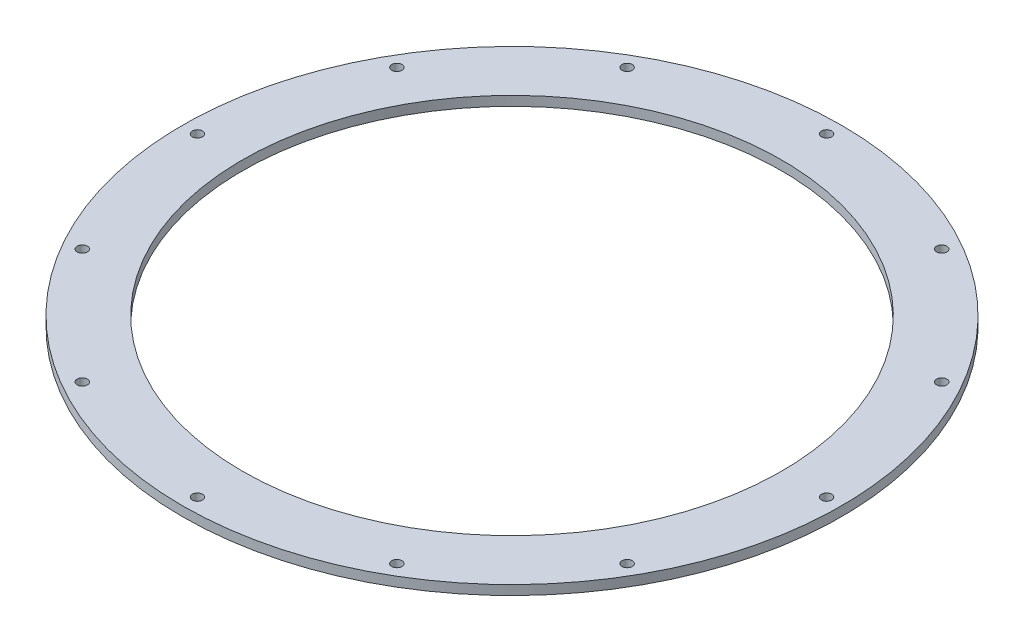
ISO-10303-21;
HEADER;
FILE_DESCRIPTION(('STEP AP214'),'2;1');
FILE_NAME('part.step','',(''),(''),'','','');
FILE_SCHEMA(('AUTOMOTIVE_DESIGN { 1 0 10303 214 1 1 1 1 }'));
ENDSEC;
DATA;
#1=APPLICATION_CONTEXT('core data for automotive mechanical design processes');
#2=APPLICATION_PROTOCOL_DEFINITION('international standard','automotive_design',2000,#1);
#3=PRODUCT_CONTEXT('',#1,'mechanical');
#4=PRODUCT('Part','Part','',(#3));
#5=PRODUCT_RELATED_PRODUCT_CATEGORY('part','',(#4));
#6=PRODUCT_DEFINITION_FORMATION('','',#4);
#7=PRODUCT_DEFINITION_CONTEXT('part definition',#1,'design');
#8=PRODUCT_DEFINITION('design','',#6,#7);
#9=PRODUCT_DEFINITION_SHAPE('','',#8);
#10=(LENGTH_UNIT() NAMED_UNIT(*) SI_UNIT(.MILLI.,.METRE.));
#11=(NAMED_UNIT(*) PLANE_ANGLE_UNIT() SI_UNIT($,.RADIAN.));
#12=(NAMED_UNIT(*) SI_UNIT($,.STERADIAN.) SOLID_ANGLE_UNIT());
#13=UNCERTAINTY_MEASURE_WITH_UNIT(LENGTH_MEASURE(1.E-05),#10,'distance_accuracy_value','');
#14=(GEOMETRIC_REPRESENTATION_CONTEXT(3) GLOBAL_UNCERTAINTY_ASSIGNED_CONTEXT((#13)) GLOBAL_UNIT_ASSIGNED_CONTEXT((#10,
#11,#12)) REPRESENTATION_CONTEXT('',''));
#15=CARTESIAN_POINT('',(0.,0.,0.));
#16=DIRECTION('',(0.,0.,1.));
#17=DIRECTION('',(1.,0.,0.));
#18=AXIS2_PLACEMENT_3D('',#15,#16,#17);
#19=CARTESIAN_POINT('',(0.,3.175,0.));
#20=DIRECTION('',(0.,1.,0.));
#21=DIRECTION('',(0.,0.,1.));
#22=AXIS2_PLACEMENT_3D('',#19,#20,#21);
#23=PLANE('',#22);
#24=CARTESIAN_POINT('',(0.,3.175,-105.));
#25=DIRECTION('',(0.,1.,0.));
#26=DIRECTION('',(0.,0.,1.));
#27=AXIS2_PLACEMENT_3D('',#24,#25,#26);
#28=CIRCLE('',#27,1.69999999999999);
#29=CARTESIAN_POINT('',(0.,3.175,-103.3));
#30=VERTEX_POINT('',#29);
#31=EDGE_CURVE('E120',#30,#30,#28,.T.);
#32=ORIENTED_EDGE('',*,*,#31,.F.);
#33=EDGE_LOOP('',(#32));
#34=FACE_BOUND('',#33,.T.);
#35=CARTESIAN_POINT('',(52.5,3.175,-90.9326673973661));
#36=DIRECTION('',(0.,1.,0.));
#37=DIRECTION('',(0.,0.,1.));
#38=AXIS2_PLACEMENT_3D('',#35,#36,#37);
#39=CIRCLE('',#38,1.69999999999999);
#40=CARTESIAN_POINT('',(52.5,3.175,-89.2326673973661));
#41=VERTEX_POINT('',#40);
#42=EDGE_CURVE('E114',#41,#41,#39,.T.);
#43=ORIENTED_EDGE('',*,*,#42,.F.);
#44=EDGE_LOOP('',(#43));
#45=FACE_BOUND('',#44,.T.);
#46=CARTESIAN_POINT('',(90.932667397366,3.175,-52.5));
#47=DIRECTION('',(0.,1.,0.));
#48=DIRECTION('',(0.,0.,1.));
#49=AXIS2_PLACEMENT_3D('',#46,#47,#48);
#50=CIRCLE('',#49,1.69999999999999);
#51=CARTESIAN_POINT('',(90.932667397366,3.175,-50.8));
#52=VERTEX_POINT('',#51);
#53=EDGE_CURVE('E108',#52,#52,#50,.T.);
#54=ORIENTED_EDGE('',*,*,#53,.F.);
#55=EDGE_LOOP('',(#54));
#56=FACE_BOUND('',#55,.T.);
#57=CARTESIAN_POINT('',(105.,3.175,0.));
#58=DIRECTION('',(0.,1.,0.));
#59=DIRECTION('',(0.,0.,1.));
#60=AXIS2_PLACEMENT_3D('',#57,#58,#59);
#61=CIRCLE('',#60,1.69999999999999);
#62=CARTESIAN_POINT('',(105.,3.175,1.69999999999999));
#63=VERTEX_POINT('',#62);
#64=EDGE_CURVE('E102',#63,#63,#61,.T.);
#65=ORIENTED_EDGE('',*,*,#64,.F.);
#66=EDGE_LOOP('',(#65));
#67=FACE_BOUND('',#66,.T.);
#68=CARTESIAN_POINT('',(90.9326673973661,3.175,52.5));
#69=DIRECTION('',(0.,1.,0.));
#70=DIRECTION('',(0.,0.,1.));
#71=AXIS2_PLACEMENT_3D('',#68,#69,#70);
#72=CIRCLE('',#71,1.69999999999999);
#73=CARTESIAN_POINT('',(90.9326673973661,3.175,54.2));
#74=VERTEX_POINT('',#73);
#75=EDGE_CURVE('E96',#74,#74,#72,.T.);
#76=ORIENTED_EDGE('',*,*,#75,.F.);
#77=EDGE_LOOP('',(#76));
#78=FACE_BOUND('',#77,.T.);
#79=CARTESIAN_POINT('',(52.5,3.175,90.932667397366));
#80=DIRECTION('',(0.,1.,0.));
#81=DIRECTION('',(0.,0.,1.));
#82=AXIS2_PLACEMENT_3D('',#79,#80,#81);
#83=CIRCLE('',#82,1.69999999999999);
#84=CARTESIAN_POINT('',(52.5,3.175,92.632667397366));
#85=VERTEX_POINT('',#84);
#86=EDGE_CURVE('E90',#85,#85,#83,.T.);
#87=ORIENTED_EDGE('',*,*,#86,.F.);
#88=EDGE_LOOP('',(#87));
#89=FACE_BOUND('',#88,.T.);
#90=CARTESIAN_POINT('',(0.,3.175,105.));
#91=DIRECTION('',(0.,1.,0.));
#92=DIRECTION('',(0.,0.,1.));
#93=AXIS2_PLACEMENT_3D('',#90,#91,#92);
#94=CIRCLE('',#93,1.69999999999999);
#95=CARTESIAN_POINT('',(0.,3.175,106.7));
#96=VERTEX_POINT('',#95);
#97=EDGE_CURVE('E84',#96,#96,#94,.T.);
#98=ORIENTED_EDGE('',*,*,#97,.F.);
#99=EDGE_LOOP('',(#98));
#100=FACE_BOUND('',#99,.T.);
#101=CARTESIAN_POINT('',(-52.5,3.175,90.9326673973661));
#102=DIRECTION('',(0.,1.,0.));
#103=DIRECTION('',(0.,0.,1.));
#104=AXIS2_PLACEMENT_3D('',#101,#102,#103);
#105=CIRCLE('',#104,1.69999999999999);
#106=CARTESIAN_POINT('',(-52.5,3.175,92.6326673973661));
#107=VERTEX_POINT('',#106);
#108=EDGE_CURVE('E78',#107,#107,#105,.T.);
#109=ORIENTED_EDGE('',*,*,#108,.F.);
#110=EDGE_LOOP('',(#109));
#111=FACE_BOUND('',#110,.T.);
#112=CARTESIAN_POINT('',(-90.932667397366,3.175,52.5));
#113=DIRECTION('',(0.,1.,0.));
#114=DIRECTION('',(0.,0.,1.));
#115=AXIS2_PLACEMENT_3D('',#112,#113,#114);
#116=CIRCLE('',#115,1.69999999999999);
#117=CARTESIAN_POINT('',(-90.932667397366,3.175,54.2));
#118=VERTEX_POINT('',#117);
#119=EDGE_CURVE('E72',#118,#118,#116,.T.);
#120=ORIENTED_EDGE('',*,*,#119,.F.);
#121=EDGE_LOOP('',(#120));
#122=FACE_BOUND('',#121,.T.);
#123=CARTESIAN_POINT('',(-105.,3.175,0.));
#124=DIRECTION('',(0.,1.,0.));
#125=DIRECTION('',(0.,0.,1.));
#126=AXIS2_PLACEMENT_3D('',#123,#124,#125);
#127=CIRCLE('',#126,1.69999999999999);
#128=CARTESIAN_POINT('',(-105.,3.175,1.70000000000001));
#129=VERTEX_POINT('',#128);
#130=EDGE_CURVE('E66',#129,#129,#127,.T.);
#131=ORIENTED_EDGE('',*,*,#130,.F.);
#132=EDGE_LOOP('',(#131));
#133=FACE_BOUND('',#132,.T.);
#134=CARTESIAN_POINT('',(-90.9326673973661,3.175,-52.4999999999999));
#135=DIRECTION('',(0.,1.,0.));
#136=DIRECTION('',(0.,0.,1.));
#137=AXIS2_PLACEMENT_3D('',#134,#135,#136);
#138=CIRCLE('',#137,1.69999999999999);
#139=CARTESIAN_POINT('',(-90.9326673973661,3.175,-50.7999999999999));
#140=VERTEX_POINT('',#139);
#141=EDGE_CURVE('E60',#140,#140,#138,.T.);
#142=ORIENTED_EDGE('',*,*,#141,.F.);
#143=EDGE_LOOP('',(#142));
#144=FACE_BOUND('',#143,.T.);
#145=CARTESIAN_POINT('',(-52.5,3.175,-90.932667397366));
#146=DIRECTION('',(0.,1.,0.));
#147=DIRECTION('',(0.,0.,1.));
#148=AXIS2_PLACEMENT_3D('',#145,#146,#147);
#149=CIRCLE('',#148,1.69999999999999);
#150=CARTESIAN_POINT('',(-52.5,3.175,-89.2326673973661));
#151=VERTEX_POINT('',#150);
#152=EDGE_CURVE('E54',#151,#151,#149,.T.);
#153=ORIENTED_EDGE('',*,*,#152,.F.);
#154=EDGE_LOOP('',(#153));
#155=FACE_BOUND('',#154,.T.);
#156=CARTESIAN_POINT('',(0.,3.175,0.));
#157=DIRECTION('',(0.,1.,0.));
#158=DIRECTION('',(0.,0.,1.));
#159=AXIS2_PLACEMENT_3D('',#156,#157,#158);
#160=CIRCLE('',#159,110.);
#161=CARTESIAN_POINT('',(0.,3.175,110.));
#162=VERTEX_POINT('',#161);
#163=EDGE_CURVE('E10',#162,#162,#160,.T.);
#164=ORIENTED_EDGE('',*,*,#163,.T.);
#165=EDGE_LOOP('',(#164));
#166=FACE_BOUND('',#165,.T.);
#167=CARTESIAN_POINT('',(0.,3.175,0.));
#168=DIRECTION('',(0.,1.,0.));
#169=DIRECTION('',(0.,0.,1.));
#170=AXIS2_PLACEMENT_3D('',#167,#168,#169);
#171=CIRCLE('',#170,90.);
#172=CARTESIAN_POINT('',(0.,3.175,90.));
#173=VERTEX_POINT('',#172);
#174=EDGE_CURVE('E44',#173,#173,#171,.T.);
#175=ORIENTED_EDGE('',*,*,#174,.F.);
#176=EDGE_LOOP('',(#175));
#177=FACE_BOUND('',#176,.T.);
#178=ADVANCED_FACE('F33',(#34,#45,#56,#67,#78,#89,#100,#111,#122,#133,#144,#155,#166,#177),#23,.T.);
#179=CARTESIAN_POINT('',(0.,0.,0.));
#180=DIRECTION('',(0.,1.,0.));
#181=DIRECTION('',(0.,0.,1.));
#182=AXIS2_PLACEMENT_3D('',#179,#180,#181);
#183=PLANE('',#182);
#184=CARTESIAN_POINT('',(0.,0.,-105.));
#185=DIRECTION('',(0.,1.,0.));
#186=DIRECTION('',(0.,0.,1.));
#187=AXIS2_PLACEMENT_3D('',#184,#185,#186);
#188=CIRCLE('',#187,1.69999999999999);
#189=CARTESIAN_POINT('',(0.,0.,-103.3));
#190=VERTEX_POINT('',#189);
#191=EDGE_CURVE('E117',#190,#190,#188,.T.);
#192=ORIENTED_EDGE('',*,*,#191,.T.);
#193=EDGE_LOOP('',(#192));
#194=FACE_BOUND('',#193,.T.);
#195=CARTESIAN_POINT('',(52.5,0.,-90.9326673973661));
#196=DIRECTION('',(0.,1.,0.));
#197=DIRECTION('',(0.,0.,1.));
#198=AXIS2_PLACEMENT_3D('',#195,#196,#197);
#199=CIRCLE('',#198,1.69999999999999);
#200=CARTESIAN_POINT('',(52.5,0.,-89.2326673973661));
#201=VERTEX_POINT('',#200);
#202=EDGE_CURVE('E111',#201,#201,#199,.T.);
#203=ORIENTED_EDGE('',*,*,#202,.T.);
#204=EDGE_LOOP('',(#203));
#205=FACE_BOUND('',#204,.T.);
#206=CARTESIAN_POINT('',(90.932667397366,0.,-52.5));
#207=DIRECTION('',(0.,1.,0.));
#208=DIRECTION('',(0.,0.,1.));
#209=AXIS2_PLACEMENT_3D('',#206,#207,#208);
#210=CIRCLE('',#209,1.69999999999999);
#211=CARTESIAN_POINT('',(90.932667397366,0.,-50.8));
#212=VERTEX_POINT('',#211);
#213=EDGE_CURVE('E105',#212,#212,#210,.T.);
#214=ORIENTED_EDGE('',*,*,#213,.T.);
#215=EDGE_LOOP('',(#214));
#216=FACE_BOUND('',#215,.T.);
#217=CARTESIAN_POINT('',(105.,0.,0.));
#218=DIRECTION('',(0.,1.,0.));
#219=DIRECTION('',(0.,0.,1.));
#220=AXIS2_PLACEMENT_3D('',#217,#218,#219);
#221=CIRCLE('',#220,1.69999999999999);
#222=CARTESIAN_POINT('',(105.,0.,1.69999999999999));
#223=VERTEX_POINT('',#222);
#224=EDGE_CURVE('E99',#223,#223,#221,.T.);
#225=ORIENTED_EDGE('',*,*,#224,.T.);
#226=EDGE_LOOP('',(#225));
#227=FACE_BOUND('',#226,.T.);
#228=CARTESIAN_POINT('',(90.9326673973661,0.,52.5));
#229=DIRECTION('',(0.,1.,0.));
#230=DIRECTION('',(0.,0.,1.));
#231=AXIS2_PLACEMENT_3D('',#228,#229,#230);
#232=CIRCLE('',#231,1.69999999999999);
#233=CARTESIAN_POINT('',(90.9326673973661,0.,54.2));
#234=VERTEX_POINT('',#233);
#235=EDGE_CURVE('E93',#234,#234,#232,.T.);
#236=ORIENTED_EDGE('',*,*,#235,.T.);
#237=EDGE_LOOP('',(#236));
#238=FACE_BOUND('',#237,.T.);
#239=CARTESIAN_POINT('',(52.5,0.,90.932667397366));
#240=DIRECTION('',(0.,1.,0.));
#241=DIRECTION('',(0.,0.,1.));
#242=AXIS2_PLACEMENT_3D('',#239,#240,#241);
#243=CIRCLE('',#242,1.69999999999999);
#244=CARTESIAN_POINT('',(52.5,0.,92.632667397366));
#245=VERTEX_POINT('',#244);
#246=EDGE_CURVE('E87',#245,#245,#243,.T.);
#247=ORIENTED_EDGE('',*,*,#246,.T.);
#248=EDGE_LOOP('',(#247));
#249=FACE_BOUND('',#248,.T.);
#250=CARTESIAN_POINT('',(0.,0.,105.));
#251=DIRECTION('',(0.,1.,0.));
#252=DIRECTION('',(0.,0.,1.));
#253=AXIS2_PLACEMENT_3D('',#250,#251,#252);
#254=CIRCLE('',#253,1.69999999999999);
#255=CARTESIAN_POINT('',(0.,0.,106.7));
#256=VERTEX_POINT('',#255);
#257=EDGE_CURVE('E81',#256,#256,#254,.T.);
#258=ORIENTED_EDGE('',*,*,#257,.T.);
#259=EDGE_LOOP('',(#258));
#260=FACE_BOUND('',#259,.T.);
#261=CARTESIAN_POINT('',(-52.5,0.,90.9326673973661));
#262=DIRECTION('',(0.,1.,0.));
#263=DIRECTION('',(0.,0.,1.));
#264=AXIS2_PLACEMENT_3D('',#261,#262,#263);
#265=CIRCLE('',#264,1.69999999999999);
#266=CARTESIAN_POINT('',(-52.5,0.,92.6326673973661));
#267=VERTEX_POINT('',#266);
#268=EDGE_CURVE('E75',#267,#267,#265,.T.);
#269=ORIENTED_EDGE('',*,*,#268,.T.);
#270=EDGE_LOOP('',(#269));
#271=FACE_BOUND('',#270,.T.);
#272=CARTESIAN_POINT('',(-90.932667397366,0.,52.5));
#273=DIRECTION('',(0.,1.,0.));
#274=DIRECTION('',(0.,0.,1.));
#275=AXIS2_PLACEMENT_3D('',#272,#273,#274);
#276=CIRCLE('',#275,1.69999999999999);
#277=CARTESIAN_POINT('',(-90.932667397366,0.,54.2));
#278=VERTEX_POINT('',#277);
#279=EDGE_CURVE('E69',#278,#278,#276,.T.);
#280=ORIENTED_EDGE('',*,*,#279,.T.);
#281=EDGE_LOOP('',(#280));
#282=FACE_BOUND('',#281,.T.);
#283=CARTESIAN_POINT('',(-105.,0.,0.));
#284=DIRECTION('',(0.,1.,0.));
#285=DIRECTION('',(0.,0.,1.));
#286=AXIS2_PLACEMENT_3D('',#283,#284,#285);
#287=CIRCLE('',#286,1.69999999999999);
#288=CARTESIAN_POINT('',(-105.,0.,1.70000000000001));
#289=VERTEX_POINT('',#288);
#290=EDGE_CURVE('E63',#289,#289,#287,.T.);
#291=ORIENTED_EDGE('',*,*,#290,.T.);
#292=EDGE_LOOP('',(#291));
#293=FACE_BOUND('',#292,.T.);
#294=CARTESIAN_POINT('',(-90.9326673973661,0.,-52.4999999999999));
#295=DIRECTION('',(0.,1.,0.));
#296=DIRECTION('',(0.,0.,1.));
#297=AXIS2_PLACEMENT_3D('',#294,#295,#296);
#298=CIRCLE('',#297,1.69999999999999);
#299=CARTESIAN_POINT('',(-90.9326673973661,0.,-50.7999999999999));
#300=VERTEX_POINT('',#299);
#301=EDGE_CURVE('E57',#300,#300,#298,.T.);
#302=ORIENTED_EDGE('',*,*,#301,.T.);
#303=EDGE_LOOP('',(#302));
#304=FACE_BOUND('',#303,.T.);
#305=CARTESIAN_POINT('',(-52.5,0.,-90.932667397366));
#306=DIRECTION('',(0.,1.,0.));
#307=DIRECTION('',(0.,0.,1.));
#308=AXIS2_PLACEMENT_3D('',#305,#306,#307);
#309=CIRCLE('',#308,1.69999999999999);
#310=CARTESIAN_POINT('',(-52.5,0.,-89.2326673973661));
#311=VERTEX_POINT('',#310);
#312=EDGE_CURVE('E49',#311,#311,#309,.T.);
#313=ORIENTED_EDGE('',*,*,#312,.T.);
#314=EDGE_LOOP('',(#313));
#315=FACE_BOUND('',#314,.T.);
#316=CARTESIAN_POINT('',(0.,0.,0.));
#317=DIRECTION('',(0.,1.,0.));
#318=DIRECTION('',(0.,0.,1.));
#319=AXIS2_PLACEMENT_3D('',#316,#317,#318);
#320=CIRCLE('',#319,110.);
#321=CARTESIAN_POINT('',(0.,0.,110.));
#322=VERTEX_POINT('',#321);
#323=EDGE_CURVE('E37',#322,#322,#320,.T.);
#324=ORIENTED_EDGE('',*,*,#323,.F.);
#325=EDGE_LOOP('',(#324));
#326=FACE_BOUND('',#325,.T.);
#327=CARTESIAN_POINT('',(0.,0.,0.));
#328=DIRECTION('',(0.,1.,0.));
#329=DIRECTION('',(0.,0.,1.));
#330=AXIS2_PLACEMENT_3D('',#327,#328,#329);
#331=CIRCLE('',#330,90.);
#332=CARTESIAN_POINT('',(0.,0.,90.));
#333=VERTEX_POINT('',#332);
#334=EDGE_CURVE('E46',#333,#333,#331,.T.);
#335=ORIENTED_EDGE('',*,*,#334,.T.);
#336=EDGE_LOOP('',(#335));
#337=FACE_BOUND('',#336,.T.);
#338=ADVANCED_FACE('F128',(#194,#205,#216,#227,#238,#249,#260,#271,#282,#293,#304,#315,#326,
#337),#183,.F.);
#339=CARTESIAN_POINT('',(0.,3.175,0.));
#340=DIRECTION('',(0.,-1.,0.));
#341=DIRECTION('',(0.,0.,-1.));
#342=AXIS2_PLACEMENT_3D('',#339,#340,#341);
#343=CYLINDRICAL_SURFACE('',#342,110.);
#344=ORIENTED_EDGE('',*,*,#163,.F.);
#345=EDGE_LOOP('',(#344));
#346=FACE_BOUND('',#345,.T.);
#347=ORIENTED_EDGE('',*,*,#323,.T.);
#348=EDGE_LOOP('',(#347));
#349=FACE_BOUND('',#348,.T.);
#350=ADVANCED_FACE('F35',(#346,#349),#343,.T.);
#351=CARTESIAN_POINT('',(0.,3.175,0.));
#352=DIRECTION('',(0.,-1.,0.));
#353=DIRECTION('',(0.,0.,-1.));
#354=AXIS2_PLACEMENT_3D('',#351,#352,#353);
#355=CYLINDRICAL_SURFACE('',#354,90.);
#356=ORIENTED_EDGE('',*,*,#174,.T.);
#357=EDGE_LOOP('',(#356));
#358=FACE_BOUND('',#357,.T.);
#359=ORIENTED_EDGE('',*,*,#334,.F.);
#360=EDGE_LOOP('',(#359));
#361=FACE_BOUND('',#360,.T.);
#362=ADVANCED_FACE('F154',(#358,#361),#355,.F.);
#363=CARTESIAN_POINT('',(-52.5,3.175,-90.932667397366));
#364=DIRECTION('',(0.,1.,0.));
#365=DIRECTION('',(0.,0.,1.));
#366=AXIS2_PLACEMENT_3D('',#363,#364,#365);
#367=CYLINDRICAL_SURFACE('',#366,1.69999999999999);
#368=ORIENTED_EDGE('',*,*,#312,.F.);
#369=EDGE_LOOP('',(#368));
#370=FACE_BOUND('',#369,.T.);
#371=ORIENTED_EDGE('',*,*,#152,.T.);
#372=EDGE_LOOP('',(#371));
#373=FACE_BOUND('',#372,.T.);
#374=ADVANCED_FACE('F157',(#370,#373),#367,.F.);
#375=CARTESIAN_POINT('',(-90.9326673973661,3.175,-52.4999999999999));
#376=DIRECTION('',(0.,1.,0.));
#377=DIRECTION('',(0.,0.,1.));
#378=AXIS2_PLACEMENT_3D('',#375,#376,#377);
#379=CYLINDRICAL_SURFACE('',#378,1.69999999999999);
#380=ORIENTED_EDGE('',*,*,#301,.F.);
#381=EDGE_LOOP('',(#380));
#382=FACE_BOUND('',#381,.T.);
#383=ORIENTED_EDGE('',*,*,#141,.T.);
#384=EDGE_LOOP('',(#383));
#385=FACE_BOUND('',#384,.T.);
#386=ADVANCED_FACE('F171',(#382,#385),#379,.F.);
#387=CARTESIAN_POINT('',(-105.,3.175,0.));
#388=DIRECTION('',(0.,1.,0.));
#389=DIRECTION('',(0.,0.,1.));
#390=AXIS2_PLACEMENT_3D('',#387,#388,#389);
#391=CYLINDRICAL_SURFACE('',#390,1.69999999999999);
#392=ORIENTED_EDGE('',*,*,#290,.F.);
#393=EDGE_LOOP('',(#392));
#394=FACE_BOUND('',#393,.T.);
#395=ORIENTED_EDGE('',*,*,#130,.T.);
#396=EDGE_LOOP('',(#395));
#397=FACE_BOUND('',#396,.T.);
#398=ADVANCED_FACE('F175',(#394,#397),#391,.F.);
#399=CARTESIAN_POINT('',(-90.932667397366,3.175,52.5));
#400=DIRECTION('',(0.,1.,0.));
#401=DIRECTION('',(0.,0.,1.));
#402=AXIS2_PLACEMENT_3D('',#399,#400,#401);
#403=CYLINDRICAL_SURFACE('',#402,1.69999999999999);
#404=ORIENTED_EDGE('',*,*,#279,.F.);
#405=EDGE_LOOP('',(#404));
#406=FACE_BOUND('',#405,.T.);
#407=ORIENTED_EDGE('',*,*,#119,.T.);
#408=EDGE_LOOP('',(#407));
#409=FACE_BOUND('',#408,.T.);
#410=ADVANCED_FACE('F179',(#406,#409),#403,.F.);
#411=CARTESIAN_POINT('',(-52.5,3.175,90.9326673973661));
#412=DIRECTION('',(0.,1.,0.));
#413=DIRECTION('',(0.,0.,1.));
#414=AXIS2_PLACEMENT_3D('',#411,#412,#413);
#415=CYLINDRICAL_SURFACE('',#414,1.69999999999999);
#416=ORIENTED_EDGE('',*,*,#268,.F.);
#417=EDGE_LOOP('',(#416));
#418=FACE_BOUND('',#417,.T.);
#419=ORIENTED_EDGE('',*,*,#108,.T.);
#420=EDGE_LOOP('',(#419));
#421=FACE_BOUND('',#420,.T.);
#422=ADVANCED_FACE('F183',(#418,#421),#415,.F.);
#423=CARTESIAN_POINT('',(0.,3.175,105.));
#424=DIRECTION('',(0.,1.,0.));
#425=DIRECTION('',(0.,0.,1.));
#426=AXIS2_PLACEMENT_3D('',#423,#424,#425);
#427=CYLINDRICAL_SURFACE('',#426,1.69999999999999);
#428=ORIENTED_EDGE('',*,*,#257,.F.);
#429=EDGE_LOOP('',(#428));
#430=FACE_BOUND('',#429,.T.);
#431=ORIENTED_EDGE('',*,*,#97,.T.);
#432=EDGE_LOOP('',(#431));
#433=FACE_BOUND('',#432,.T.);
#434=ADVANCED_FACE('F187',(#430,#433),#427,.F.);
#435=CARTESIAN_POINT('',(52.5,3.175,90.932667397366));
#436=DIRECTION('',(0.,1.,0.));
#437=DIRECTION('',(0.,0.,1.));
#438=AXIS2_PLACEMENT_3D('',#435,#436,#437);
#439=CYLINDRICAL_SURFACE('',#438,1.69999999999999);
#440=ORIENTED_EDGE('',*,*,#246,.F.);
#441=EDGE_LOOP('',(#440));
#442=FACE_BOUND('',#441,.T.);
#443=ORIENTED_EDGE('',*,*,#86,.T.);
#444=EDGE_LOOP('',(#443));
#445=FACE_BOUND('',#444,.T.);
#446=ADVANCED_FACE('F191',(#442,#445),#439,.F.);
#447=CARTESIAN_POINT('',(90.9326673973661,3.175,52.5));
#448=DIRECTION('',(0.,1.,0.));
#449=DIRECTION('',(0.,0.,1.));
#450=AXIS2_PLACEMENT_3D('',#447,#448,#449);
#451=CYLINDRICAL_SURFACE('',#450,1.69999999999999);
#452=ORIENTED_EDGE('',*,*,#235,.F.);
#453=EDGE_LOOP('',(#452));
#454=FACE_BOUND('',#453,.T.);
#455=ORIENTED_EDGE('',*,*,#75,.T.);
#456=EDGE_LOOP('',(#455));
#457=FACE_BOUND('',#456,.T.);
#458=ADVANCED_FACE('F195',(#454,#457),#451,.F.);
#459=CARTESIAN_POINT('',(105.,3.175,0.));
#460=DIRECTION('',(0.,1.,0.));
#461=DIRECTION('',(0.,0.,1.));
#462=AXIS2_PLACEMENT_3D('',#459,#460,#461);
#463=CYLINDRICAL_SURFACE('',#462,1.69999999999999);
#464=ORIENTED_EDGE('',*,*,#224,.F.);
#465=EDGE_LOOP('',(#464));
#466=FACE_BOUND('',#465,.T.);
#467=ORIENTED_EDGE('',*,*,#64,.T.);
#468=EDGE_LOOP('',(#467));
#469=FACE_BOUND('',#468,.T.);
#470=ADVANCED_FACE('F199',(#466,#469),#463,.F.);
#471=CARTESIAN_POINT('',(90.932667397366,3.175,-52.5));
#472=DIRECTION('',(0.,1.,0.));
#473=DIRECTION('',(0.,0.,1.));
#474=AXIS2_PLACEMENT_3D('',#471,#472,#473);
#475=CYLINDRICAL_SURFACE('',#474,1.69999999999999);
#476=ORIENTED_EDGE('',*,*,#213,.F.);
#477=EDGE_LOOP('',(#476));
#478=FACE_BOUND('',#477,.T.);
#479=ORIENTED_EDGE('',*,*,#53,.T.);
#480=EDGE_LOOP('',(#479));
#481=FACE_BOUND('',#480,.T.);
#482=ADVANCED_FACE('F203',(#478,#481),#475,.F.);
#483=CARTESIAN_POINT('',(52.5,3.175,-90.9326673973661));
#484=DIRECTION('',(0.,1.,0.));
#485=DIRECTION('',(0.,0.,1.));
#486=AXIS2_PLACEMENT_3D('',#483,#484,#485);
#487=CYLINDRICAL_SURFACE('',#486,1.69999999999999);
#488=ORIENTED_EDGE('',*,*,#202,.F.);
#489=EDGE_LOOP('',(#488));
#490=FACE_BOUND('',#489,.T.);
#491=ORIENTED_EDGE('',*,*,#42,.T.);
#492=EDGE_LOOP('',(#491));
#493=FACE_BOUND('',#492,.T.);
#494=ADVANCED_FACE('F207',(#490,#493),#487,.F.);
#495=CARTESIAN_POINT('',(0.,3.175,-105.));
#496=DIRECTION('',(0.,1.,0.));
#497=DIRECTION('',(0.,0.,1.));
#498=AXIS2_PLACEMENT_3D('',#495,#496,#497);
#499=CYLINDRICAL_SURFACE('',#498,1.69999999999999);
#500=ORIENTED_EDGE('',*,*,#191,.F.);
#501=EDGE_LOOP('',(#500));
#502=FACE_BOUND('',#501,.T.);
#503=ORIENTED_EDGE('',*,*,#31,.T.);
#504=EDGE_LOOP('',(#503));
#505=FACE_BOUND('',#504,.T.);
#506=ADVANCED_FACE('F124',(#502,#505),#499,.F.);
#507=CLOSED_SHELL('',(#178,#338,#350,#362,#374,#386,#398,#410,#422,#434,#446,#458,#470,#482,
#494,#506));
#508=MANIFOLD_SOLID_BREP('B2',#507);
#509=ADVANCED_BREP_SHAPE_REPRESENTATION('',(#18,#508),#14);
#510=SHAPE_DEFINITION_REPRESENTATION(#9,#509);
ENDSEC;
END-ISO-10303-21;
